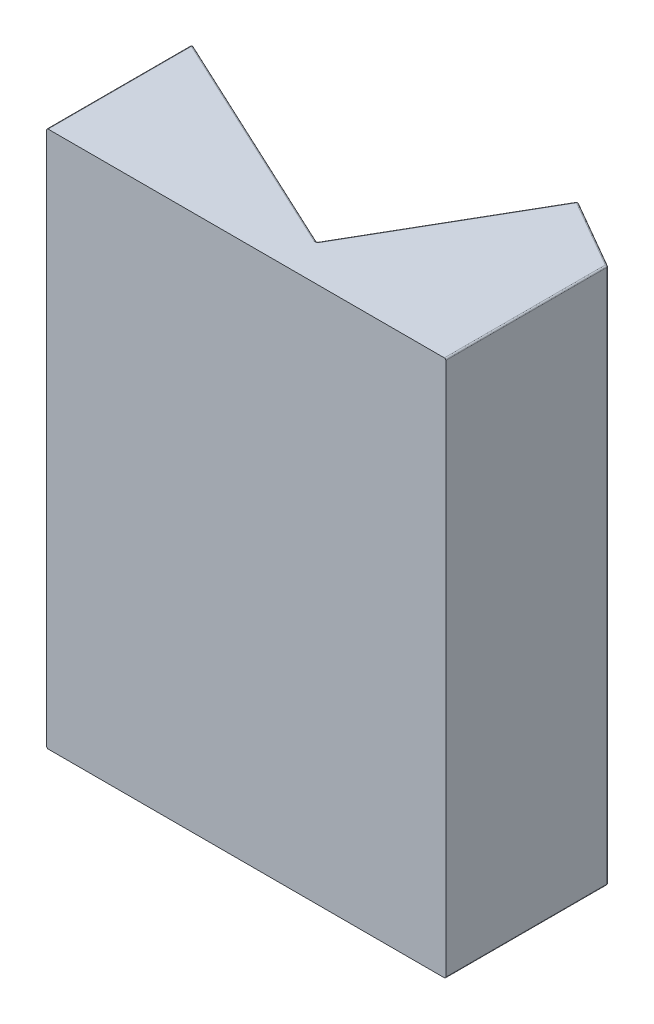
ISO-10303-21;
HEADER;
FILE_DESCRIPTION(('STEP AP214'),'2;1');
FILE_NAME('part.step','',(''),(''),'','','');
FILE_SCHEMA(('AUTOMOTIVE_DESIGN { 1 0 10303 214 1 1 1 1 }'));
ENDSEC;
DATA;
#1=APPLICATION_CONTEXT('core data for automotive mechanical design processes');
#2=APPLICATION_PROTOCOL_DEFINITION('international standard','automotive_design',2000,#1);
#3=PRODUCT_CONTEXT('',#1,'mechanical');
#4=PRODUCT('Part','Part','',(#3));
#5=PRODUCT_RELATED_PRODUCT_CATEGORY('part','',(#4));
#6=PRODUCT_DEFINITION_FORMATION('','',#4);
#7=PRODUCT_DEFINITION_CONTEXT('part definition',#1,'design');
#8=PRODUCT_DEFINITION('design','',#6,#7);
#9=PRODUCT_DEFINITION_SHAPE('','',#8);
#10=(LENGTH_UNIT() NAMED_UNIT(*) SI_UNIT(.MILLI.,.METRE.));
#11=(NAMED_UNIT(*) PLANE_ANGLE_UNIT() SI_UNIT($,.RADIAN.));
#12=(NAMED_UNIT(*) SI_UNIT($,.STERADIAN.) SOLID_ANGLE_UNIT());
#13=UNCERTAINTY_MEASURE_WITH_UNIT(LENGTH_MEASURE(1.E-05),#10,'distance_accuracy_value','');
#14=(GEOMETRIC_REPRESENTATION_CONTEXT(3) GLOBAL_UNCERTAINTY_ASSIGNED_CONTEXT((#13)) GLOBAL_UNIT_ASSIGNED_CONTEXT((#10,
#11,#12)) REPRESENTATION_CONTEXT('',''));
#15=CARTESIAN_POINT('',(0.,0.,0.));
#16=DIRECTION('',(0.,0.,1.));
#17=DIRECTION('',(1.,0.,0.));
#18=AXIS2_PLACEMENT_3D('',#15,#16,#17);
#19=CARTESIAN_POINT('',(31.720772546283,73.,-5.));
#20=DIRECTION('',(-0.422618261740682,0.,0.906307787036658));
#21=DIRECTION('',(0.906307787036658,0.,0.422618261740682));
#22=AXIS2_PLACEMENT_3D('',#19,#20,#21);
#23=PLANE('',#22);
#24=DIRECTION('',(-0.906307787036658,0.,-0.422618261740682));
#25=VECTOR('',#24,1.);
#26=CARTESIAN_POINT('',(0.,0.200000000000006,-19.7916391609239));
#27=LINE('',#26,#25);
#28=CARTESIAN_POINT('',(31.5546769305797,0.200000000000006,-5.07745165758841));
#29=VERTEX_POINT('',#28);
#30=CARTESIAN_POINT('',(0.284523652348131,0.200000000000006,-19.6589636029077));
#31=VERTEX_POINT('',#30);
#32=EDGE_CURVE('E162',#29,#31,#27,.T.);
#33=ORIENTED_EDGE('',*,*,#32,.T.);
#34=DIRECTION('',(0.,-1.,0.));
#35=VECTOR('',#34,1.);
#36=CARTESIAN_POINT('',(0.284523652348129,73.,-19.6589636029077));
#37=LINE('',#36,#35);
#38=CARTESIAN_POINT('',(0.284523652348131,72.8,-19.6589636029077));
#39=VERTEX_POINT('',#38);
#40=EDGE_CURVE('E158',#31,#39,#37,.F.);
#41=ORIENTED_EDGE('',*,*,#40,.T.);
#42=DIRECTION('',(-0.906307787036658,0.,-0.422618261740682));
#43=VECTOR('',#42,1.);
#44=CARTESIAN_POINT('',(31.720772546283,72.8,-5.));
#45=LINE('',#44,#43);
#46=CARTESIAN_POINT('',(31.5546769305797,72.8,-5.07745165758841));
#47=VERTEX_POINT('',#46);
#48=EDGE_CURVE('E151',#39,#47,#45,.F.);
#49=ORIENTED_EDGE('',*,*,#48,.T.);
#50=DIRECTION('',(0.,-1.,0.));
#51=VECTOR('',#50,1.);
#52=CARTESIAN_POINT('',(31.5546769305797,73.,-5.07745165758841));
#53=LINE('',#52,#51);
#54=EDGE_CURVE('E155',#47,#29,#53,.T.);
#55=ORIENTED_EDGE('',*,*,#54,.T.);
#56=EDGE_LOOP('',(#33,#41,#49,#55));
#57=FACE_BOUND('',#56,.T.);
#58=ADVANCED_FACE('F33',(#57),#23,.F.);
#59=CARTESIAN_POINT('',(0.,73.,-19.7916391609239));
#60=DIRECTION('',(1.,0.,0.));
#61=DIRECTION('',(0.,0.,-1.));
#62=AXIS2_PLACEMENT_3D('',#59,#60,#61);
#63=PLANE('',#62);
#64=DIRECTION('',(0.,-1.,0.));
#65=VECTOR('',#64,1.);
#66=CARTESIAN_POINT('',(0.,73.,0.));
#67=LINE('',#66,#65);
#68=CARTESIAN_POINT('',(0.,72.8,0.));
#69=VERTEX_POINT('',#68);
#70=CARTESIAN_POINT('',(0.,0.200000000000006,0.));
#71=VERTEX_POINT('',#70);
#72=EDGE_CURVE('E188',#69,#71,#67,.T.);
#73=ORIENTED_EDGE('',*,*,#72,.F.);
#74=DIRECTION('',(0.,0.,1.));
#75=VECTOR('',#74,1.);
#76=CARTESIAN_POINT('',(0.,72.8,-19.7916391609239));
#77=LINE('',#76,#75);
#78=CARTESIAN_POINT('',(0.,72.8,-19.4777020455004));
#79=VERTEX_POINT('',#78);
#80=EDGE_CURVE('E235',#69,#79,#77,.F.);
#81=ORIENTED_EDGE('',*,*,#80,.T.);
#82=DIRECTION('',(0.,-1.,0.));
#83=VECTOR('',#82,1.);
#84=CARTESIAN_POINT('',(0.,73.,-19.4777020455004));
#85=LINE('',#84,#83);
#86=CARTESIAN_POINT('',(0.,0.200000000000006,-19.4777020455004));
#87=VERTEX_POINT('',#86);
#88=EDGE_CURVE('E233',#79,#87,#85,.T.);
#89=ORIENTED_EDGE('',*,*,#88,.T.);
#90=DIRECTION('',(0.,0.,1.));
#91=VECTOR('',#90,1.);
#92=CARTESIAN_POINT('',(0.,0.200000000000006,0.));
#93=LINE('',#92,#91);
#94=EDGE_CURVE('E231',#87,#71,#93,.T.);
#95=ORIENTED_EDGE('',*,*,#94,.T.);
#96=EDGE_LOOP('',(#73,#81,#89,#95));
#97=FACE_BOUND('',#96,.T.);
#98=ADVANCED_FACE('F358',(#97),#63,.F.);
#99=CARTESIAN_POINT('',(0.,73.,0.));
#100=DIRECTION('',(0.,0.,-1.));
#101=DIRECTION('',(-1.,0.,0.));
#102=AXIS2_PLACEMENT_3D('',#99,#100,#101);
#103=PLANE('',#102);
#104=DIRECTION('',(1.,0.,0.));
#105=VECTOR('',#104,1.);
#106=CARTESIAN_POINT('',(0.,73.,0.));
#107=LINE('',#106,#105);
#108=CARTESIAN_POINT('',(0.2,73.,0.));
#109=VERTEX_POINT('',#108);
#110=CARTESIAN_POINT('',(54.0759088176121,73.,0.));
#111=VERTEX_POINT('',#110);
#112=EDGE_CURVE('E313',#109,#111,#107,.T.);
#113=ORIENTED_EDGE('',*,*,#112,.F.);
#114=CARTESIAN_POINT('',(0.2,72.8,0.));
#115=DIRECTION('',(0.,0.,-1.));
#116=DIRECTION('',(-1.,0.,0.));
#117=AXIS2_PLACEMENT_3D('',#114,#115,#116);
#118=CIRCLE('',#117,0.2);
#119=EDGE_CURVE('E243',#109,#69,#118,.F.);
#120=ORIENTED_EDGE('',*,*,#119,.T.);
#121=ORIENTED_EDGE('',*,*,#72,.T.);
#122=CARTESIAN_POINT('',(0.2,0.200000000000006,0.));
#123=DIRECTION('',(0.,0.,-1.));
#124=DIRECTION('',(-1.,0.,0.));
#125=AXIS2_PLACEMENT_3D('',#122,#123,#124);
#126=CIRCLE('',#125,0.2);
#127=CARTESIAN_POINT('',(0.2,0.,0.));
#128=VERTEX_POINT('',#127);
#129=EDGE_CURVE('E241',#71,#128,#126,.F.);
#130=ORIENTED_EDGE('',*,*,#129,.T.);
#131=DIRECTION('',(1.,0.,0.));
#132=VECTOR('',#131,1.);
#133=CARTESIAN_POINT('',(0.,0.,0.));
#134=LINE('',#133,#132);
#135=CARTESIAN_POINT('',(54.0759088176121,0.,0.));
#136=VERTEX_POINT('',#135);
#137=EDGE_CURVE('E308',#128,#136,#134,.T.);
#138=ORIENTED_EDGE('',*,*,#137,.T.);
#139=CARTESIAN_POINT('',(54.0759088176121,0.2,0.));
#140=DIRECTION('',(0.,0.,-1.));
#141=DIRECTION('',(-1.,0.,0.));
#142=AXIS2_PLACEMENT_3D('',#139,#140,#141);
#143=CIRCLE('',#142,0.2);
#144=CARTESIAN_POINT('',(54.2759088176121,0.200000000000006,0.));
#145=VERTEX_POINT('',#144);
#146=EDGE_CURVE('E239',#136,#145,#143,.F.);
#147=ORIENTED_EDGE('',*,*,#146,.T.);
#148=DIRECTION('',(0.,-1.,0.));
#149=VECTOR('',#148,1.);
#150=CARTESIAN_POINT('',(54.2759088176121,73.,0.));
#151=LINE('',#150,#149);
#152=CARTESIAN_POINT('',(54.2759088176121,72.8,0.));
#153=VERTEX_POINT('',#152);
#154=EDGE_CURVE('E191',#153,#145,#151,.T.);
#155=ORIENTED_EDGE('',*,*,#154,.F.);
#156=CARTESIAN_POINT('',(54.0759088176121,72.8,0.));
#157=DIRECTION('',(0.,0.,-1.));
#158=DIRECTION('',(-1.,0.,0.));
#159=AXIS2_PLACEMENT_3D('',#156,#157,#158);
#160=CIRCLE('',#159,0.2);
#161=EDGE_CURVE('E237',#153,#111,#160,.F.);
#162=ORIENTED_EDGE('',*,*,#161,.T.);
#163=EDGE_LOOP('',(#113,#120,#121,#130,#138,#147,#155,#162));
#164=FACE_BOUND('',#163,.T.);
#165=ADVANCED_FACE('F339',(#164),#103,.F.);
#166=CARTESIAN_POINT('',(54.2759088176121,73.,-22.));
#167=DIRECTION('',(1.,0.,0.));
#168=DIRECTION('',(0.,0.,-1.));
#169=AXIS2_PLACEMENT_3D('',#166,#167,#168);
#170=PLANE('',#169);
#171=ORIENTED_EDGE('',*,*,#154,.T.);
#172=DIRECTION('',(0.,0.,1.));
#173=VECTOR('',#172,1.);
#174=CARTESIAN_POINT('',(54.2759088176121,0.200000000000006,-22.));
#175=LINE('',#174,#173);
#176=CARTESIAN_POINT('',(54.2759088176121,0.2,-21.8845299461621));
#177=VERTEX_POINT('',#176);
#178=EDGE_CURVE('E249',#145,#177,#175,.F.);
#179=ORIENTED_EDGE('',*,*,#178,.T.);
#180=DIRECTION('',(0.,-1.,0.));
#181=VECTOR('',#180,1.);
#182=CARTESIAN_POINT('',(54.2759088176121,73.,-21.8845299461621));
#183=LINE('',#182,#181);
#184=CARTESIAN_POINT('',(54.2759088176121,72.8,-21.8845299461621));
#185=VERTEX_POINT('',#184);
#186=EDGE_CURVE('E245',#177,#185,#183,.F.);
#187=ORIENTED_EDGE('',*,*,#186,.T.);
#188=DIRECTION('',(0.,0.,1.));
#189=VECTOR('',#188,1.);
#190=CARTESIAN_POINT('',(54.2759088176121,72.8,0.));
#191=LINE('',#190,#189);
#192=EDGE_CURVE('E247',#185,#153,#191,.T.);
#193=ORIENTED_EDGE('',*,*,#192,.T.);
#194=EDGE_LOOP('',(#171,#179,#187,#193));
#195=FACE_BOUND('',#194,.T.);
#196=ADVANCED_FACE('F324',(#195),#170,.T.);
#197=CARTESIAN_POINT('',(44.720772546283,73.,-27.5166604983954));
#198=DIRECTION('',(0.499999999999998,0.,-0.866025403784439));
#199=DIRECTION('',(-0.86602540378444,0.,-0.499999999999999));
#200=AXIS2_PLACEMENT_3D('',#197,#198,#199);
#201=PLANE('',#200);
#202=DIRECTION('',(0.86602540378444,0.,0.499999999999999));
#203=VECTOR('',#202,1.);
#204=CARTESIAN_POINT('',(54.2759088176121,72.8,-22.));
#205=LINE('',#204,#203);
#206=CARTESIAN_POINT('',(44.8939776270398,72.8,-27.4166604983954));
#207=VERTEX_POINT('',#206);
#208=CARTESIAN_POINT('',(54.1759088176121,72.8,-22.057735026919));
#209=VERTEX_POINT('',#208);
#210=EDGE_CURVE('E53',#207,#209,#205,.T.);
#211=ORIENTED_EDGE('',*,*,#210,.T.);
#212=DIRECTION('',(0.,-1.,0.));
#213=VECTOR('',#212,1.);
#214=CARTESIAN_POINT('',(54.1759088176121,73.,-22.057735026919));
#215=LINE('',#214,#213);
#216=CARTESIAN_POINT('',(54.1759088176121,0.2,-22.057735026919));
#217=VERTEX_POINT('',#216);
#218=EDGE_CURVE('E11',#209,#217,#215,.T.);
#219=ORIENTED_EDGE('',*,*,#218,.T.);
#220=DIRECTION('',(0.86602540378444,0.,0.499999999999999));
#221=VECTOR('',#220,1.);
#222=CARTESIAN_POINT('',(44.720772546283,0.200000000000006,-27.5166604983954));
#223=LINE('',#222,#221);
#224=CARTESIAN_POINT('',(44.8939776270398,0.2,-27.4166604983954));
#225=VERTEX_POINT('',#224);
#226=EDGE_CURVE('E42',#217,#225,#223,.F.);
#227=ORIENTED_EDGE('',*,*,#226,.T.);
#228=DIRECTION('',(0.,-1.,0.));
#229=VECTOR('',#228,1.);
#230=CARTESIAN_POINT('',(44.8939776270398,73.,-27.4166604983954));
#231=LINE('',#230,#229);
#232=EDGE_CURVE('E251',#225,#207,#231,.F.);
#233=ORIENTED_EDGE('',*,*,#232,.T.);
#234=EDGE_LOOP('',(#211,#219,#227,#233));
#235=FACE_BOUND('',#234,.T.);
#236=ADVANCED_FACE('F388',(#235),#201,.T.);
#237=CARTESIAN_POINT('',(31.720772546283,73.,-5.));
#238=DIRECTION('',(-0.86602540378444,0.,-0.499999999999998));
#239=DIRECTION('',(-0.499999999999998,0.,0.86602540378444));
#240=AXIS2_PLACEMENT_3D('',#237,#238,#239);
#241=PLANE('',#240);
#242=DIRECTION('',(0.499999999999998,0.,-0.86602540378444));
#243=VECTOR('',#242,1.);
#244=CARTESIAN_POINT('',(31.720772546283,0.200000000000006,-5.));
#245=LINE('',#244,#243);
#246=CARTESIAN_POINT('',(44.620772546283,0.2,-27.3434554176385));
#247=VERTEX_POINT('',#246);
#248=CARTESIAN_POINT('',(31.8124056636848,0.2,-5.15871321499574));
#249=VERTEX_POINT('',#248);
#250=EDGE_CURVE('E215',#247,#249,#245,.F.);
#251=ORIENTED_EDGE('',*,*,#250,.T.);
#252=DIRECTION('',(0.,-1.,0.));
#253=VECTOR('',#252,1.);
#254=CARTESIAN_POINT('',(31.8124056636848,73.,-5.15871321499574));
#255=LINE('',#254,#253);
#256=CARTESIAN_POINT('',(31.8124056636848,72.8,-5.15871321499574));
#257=VERTEX_POINT('',#256);
#258=EDGE_CURVE('E218',#249,#257,#255,.F.);
#259=ORIENTED_EDGE('',*,*,#258,.T.);
#260=DIRECTION('',(0.499999999999998,0.,-0.86602540378444));
#261=VECTOR('',#260,1.);
#262=CARTESIAN_POINT('',(44.720772546283,72.8,-27.5166604983954));
#263=LINE('',#262,#261);
#264=CARTESIAN_POINT('',(44.620772546283,72.8,-27.3434554176385));
#265=VERTEX_POINT('',#264);
#266=EDGE_CURVE('E213',#257,#265,#263,.T.);
#267=ORIENTED_EDGE('',*,*,#266,.T.);
#268=DIRECTION('',(0.,-1.,0.));
#269=VECTOR('',#268,1.);
#270=CARTESIAN_POINT('',(44.620772546283,73.,-27.3434554176386));
#271=LINE('',#270,#269);
#272=EDGE_CURVE('E211',#265,#247,#271,.T.);
#273=ORIENTED_EDGE('',*,*,#272,.T.);
#274=EDGE_LOOP('',(#251,#259,#267,#273));
#275=FACE_BOUND('',#274,.T.);
#276=ADVANCED_FACE('F382',(#275),#241,.T.);
#277=CARTESIAN_POINT('',(0.,73.,0.));
#278=DIRECTION('',(0.,-1.,0.));
#279=DIRECTION('',(0.,0.,-1.));
#280=AXIS2_PLACEMENT_3D('',#277,#278,#279);
#281=PLANE('',#280);
#282=DIRECTION('',(-0.906307787036658,0.,-0.422618261740682));
#283=VECTOR('',#282,1.);
#284=CARTESIAN_POINT('',(7.49611394737246,73.,-16.0754682370693));
#285=LINE('',#284,#283);
#286=CARTESIAN_POINT('',(31.4701532782316,73.,-4.89619010018108));
#287=VERTEX_POINT('',#286);
#288=CARTESIAN_POINT('',(0.199999999999994,73.,-19.4777020455004));
#289=VERTEX_POINT('',#288);
#290=EDGE_CURVE('E169',#287,#289,#285,.T.);
#291=ORIENTED_EDGE('',*,*,#290,.T.);
#292=DIRECTION('',(0.,0.,1.));
#293=VECTOR('',#292,1.);
#294=CARTESIAN_POINT('',(0.2,73.,0.));
#295=LINE('',#294,#293);
#296=EDGE_CURVE('E229',#289,#109,#295,.T.);
#297=ORIENTED_EDGE('',*,*,#296,.T.);
#298=ORIENTED_EDGE('',*,*,#112,.T.);
#299=DIRECTION('',(0.,0.,1.));
#300=VECTOR('',#299,1.);
#301=CARTESIAN_POINT('',(54.0759088176121,73.,-22.));
#302=LINE('',#301,#300);
#303=CARTESIAN_POINT('',(54.0759088176121,73.,-21.8845299461621));
#304=VERTEX_POINT('',#303);
#305=EDGE_CURVE('E220',#111,#304,#302,.F.);
#306=ORIENTED_EDGE('',*,*,#305,.T.);
#307=DIRECTION('',(0.86602540378444,0.,0.499999999999999));
#308=VECTOR('',#307,1.);
#309=CARTESIAN_POINT('',(44.620772546283,73.,-27.3434554176385));
#310=LINE('',#309,#308);
#311=CARTESIAN_POINT('',(44.7939776270398,73.,-27.2434554176385));
#312=VERTEX_POINT('',#311);
#313=EDGE_CURVE('E222',#304,#312,#310,.F.);
#314=ORIENTED_EDGE('',*,*,#313,.T.);
#315=DIRECTION('',(0.499999999999998,0.,-0.86602540378444));
#316=VECTOR('',#315,1.);
#317=CARTESIAN_POINT('',(31.8939776270399,73.,-4.9));
#318=LINE('',#317,#316);
#319=CARTESIAN_POINT('',(31.9856107444416,73.,-5.05871321499574));
#320=VERTEX_POINT('',#319);
#321=EDGE_CURVE('E224',#312,#320,#318,.F.);
#322=ORIENTED_EDGE('',*,*,#321,.T.);
#323=CARTESIAN_POINT('',(31.6392005829279,73.,-5.25871321499574));
#324=DIRECTION('',(0.,-1.,0.));
#325=DIRECTION('',(0.,0.,-1.));
#326=AXIS2_PLACEMENT_3D('',#323,#324,#325);
#327=CIRCLE('',#326,0.4);
#328=EDGE_CURVE('E226',#287,#320,#327,.F.);
#329=ORIENTED_EDGE('',*,*,#328,.F.);
#330=EDGE_LOOP('',(#291,#297,#298,#306,#314,#322,#329));
#331=FACE_BOUND('',#330,.T.);
#332=ADVANCED_FACE('F342',(#331),#281,.F.);
#333=CARTESIAN_POINT('',(0.,0.,0.));
#334=DIRECTION('',(0.,-1.,0.));
#335=DIRECTION('',(0.,0.,-1.));
#336=AXIS2_PLACEMENT_3D('',#333,#334,#335);
#337=PLANE('',#336);
#338=ORIENTED_EDGE('',*,*,#137,.F.);
#339=DIRECTION('',(0.,0.,1.));
#340=VECTOR('',#339,1.);
#341=CARTESIAN_POINT('',(0.199999999999994,0.,-19.7916391609239));
#342=LINE('',#341,#340);
#343=CARTESIAN_POINT('',(0.199999999999994,0.,-19.4777020455004));
#344=VERTEX_POINT('',#343);
#345=EDGE_CURVE('E209',#128,#344,#342,.F.);
#346=ORIENTED_EDGE('',*,*,#345,.T.);
#347=DIRECTION('',(-0.906307787036658,0.,-0.422618261740682));
#348=VECTOR('',#347,1.);
#349=CARTESIAN_POINT('',(31.6362488939349,0.,-4.81873844259267));
#350=LINE('',#349,#348);
#351=CARTESIAN_POINT('',(31.4701532782316,0.,-4.89619010018108));
#352=VERTEX_POINT('',#351);
#353=EDGE_CURVE('E206',#344,#352,#350,.F.);
#354=ORIENTED_EDGE('',*,*,#353,.T.);
#355=CARTESIAN_POINT('',(31.6392005829279,0.,-5.25871321499574));
#356=DIRECTION('',(0.,-1.,0.));
#357=DIRECTION('',(0.,0.,-1.));
#358=AXIS2_PLACEMENT_3D('',#355,#356,#357);
#359=CIRCLE('',#358,0.4);
#360=CARTESIAN_POINT('',(31.9856107444416,0.,-5.05871321499574));
#361=VERTEX_POINT('',#360);
#362=EDGE_CURVE('E203',#361,#352,#359,.T.);
#363=ORIENTED_EDGE('',*,*,#362,.F.);
#364=DIRECTION('',(0.499999999999998,0.,-0.86602540378444));
#365=VECTOR('',#364,1.);
#366=CARTESIAN_POINT('',(21.7987209810081,0.,12.5854974263745));
#367=LINE('',#366,#365);
#368=CARTESIAN_POINT('',(44.7939776270399,0.,-27.2434554176386));
#369=VERTEX_POINT('',#368);
#370=EDGE_CURVE('E201',#361,#369,#367,.T.);
#371=ORIENTED_EDGE('',*,*,#370,.T.);
#372=DIRECTION('',(0.86602540378444,0.,0.499999999999999));
#373=VECTOR('',#372,1.);
#374=CARTESIAN_POINT('',(22.9952566460318,0.,-39.8289528440131));
#375=LINE('',#374,#373);
#376=CARTESIAN_POINT('',(54.0759088176121,0.,-21.8845299461621));
#377=VERTEX_POINT('',#376);
#378=EDGE_CURVE('E197',#369,#377,#375,.T.);
#379=ORIENTED_EDGE('',*,*,#378,.T.);
#380=DIRECTION('',(0.,0.,1.));
#381=VECTOR('',#380,1.);
#382=CARTESIAN_POINT('',(54.0759088176121,0.,0.));
#383=LINE('',#382,#381);
#384=EDGE_CURVE('E199',#377,#136,#383,.T.);
#385=ORIENTED_EDGE('',*,*,#384,.T.);
#386=EDGE_LOOP('',(#338,#346,#354,#363,#371,#379,#385));
#387=FACE_BOUND('',#386,.T.);
#388=ADVANCED_FACE('F366',(#387),#337,.T.);
#389=CARTESIAN_POINT('',(54.0759088176121,72.8,-22.));
#390=DIRECTION('',(0.,0.,-1.));
#391=DIRECTION('',(-1.,0.,0.));
#392=AXIS2_PLACEMENT_3D('',#389,#390,#391);
#393=CYLINDRICAL_SURFACE('',#392,0.2);
#394=CARTESIAN_POINT('',(54.0759088176121,72.8,-21.8845299461621));
#395=DIRECTION('',(0.,0.,-1.));
#396=DIRECTION('',(-1.,0.,0.));
#397=AXIS2_PLACEMENT_3D('',#394,#395,#396);
#398=CIRCLE('',#397,0.2);
#399=EDGE_CURVE('E37',#304,#185,#398,.T.);
#400=ORIENTED_EDGE('',*,*,#399,.F.);
#401=ORIENTED_EDGE('',*,*,#305,.F.);
#402=ORIENTED_EDGE('',*,*,#161,.F.);
#403=ORIENTED_EDGE('',*,*,#192,.F.);
#404=EDGE_LOOP('',(#400,#401,#402,#403));
#405=FACE_BOUND('',#404,.T.);
#406=ADVANCED_FACE('F35',(#405),#393,.T.);
#407=CARTESIAN_POINT('',(54.0759088176121,72.8,-21.8845299461621));
#408=DIRECTION('',(0.,0.,1.));
#409=DIRECTION('',(1.,0.,0.));
#410=AXIS2_PLACEMENT_3D('',#407,#408,#409);
#411=SPHERICAL_SURFACE('',#410,0.2);
#412=CARTESIAN_POINT('',(54.0759088176121,72.8,-21.8845299461621));
#413=DIRECTION('',(0.866025403784431,0.,0.500000000000013));
#414=DIRECTION('',(0.500000000000013,0.,-0.866025403784431));
#415=AXIS2_PLACEMENT_3D('',#412,#413,#414);
#416=CIRCLE('',#415,0.2);
#417=EDGE_CURVE('E301',#304,#209,#416,.F.);
#418=ORIENTED_EDGE('',*,*,#417,.F.);
#419=ORIENTED_EDGE('',*,*,#399,.T.);
#420=CARTESIAN_POINT('',(54.0759088176121,72.8,-21.8845299461621));
#421=DIRECTION('',(0.,1.,0.));
#422=DIRECTION('',(0.,0.,1.));
#423=AXIS2_PLACEMENT_3D('',#420,#421,#422);
#424=CIRCLE('',#423,0.2);
#425=EDGE_CURVE('E302',#209,#185,#424,.F.);
#426=ORIENTED_EDGE('',*,*,#425,.F.);
#427=EDGE_LOOP('',(#418,#419,#426));
#428=FACE_BOUND('',#427,.T.);
#429=ADVANCED_FACE('F456',(#428),#411,.T.);
#430=CARTESIAN_POINT('',(54.0759088176121,0.2,0.));
#431=DIRECTION('',(0.,0.,1.));
#432=DIRECTION('',(1.,0.,0.));
#433=AXIS2_PLACEMENT_3D('',#430,#431,#432);
#434=CYLINDRICAL_SURFACE('',#433,0.2);
#435=ORIENTED_EDGE('',*,*,#146,.F.);
#436=ORIENTED_EDGE('',*,*,#384,.F.);
#437=CARTESIAN_POINT('',(54.0759088176121,0.2,-21.8845299461621));
#438=DIRECTION('',(0.,0.,-1.));
#439=DIRECTION('',(0.,1.,0.));
#440=AXIS2_PLACEMENT_3D('',#437,#438,#439);
#441=CIRCLE('',#440,0.2);
#442=EDGE_CURVE('E298',#177,#377,#441,.T.);
#443=ORIENTED_EDGE('',*,*,#442,.F.);
#444=ORIENTED_EDGE('',*,*,#178,.F.);
#445=EDGE_LOOP('',(#435,#436,#443,#444));
#446=FACE_BOUND('',#445,.T.);
#447=ADVANCED_FACE('F329',(#446),#434,.T.);
#448=CARTESIAN_POINT('',(54.0759088176121,73.,-21.8845299461621));
#449=DIRECTION('',(0.,-1.,0.));
#450=DIRECTION('',(0.,0.,-1.));
#451=AXIS2_PLACEMENT_3D('',#448,#449,#450);
#452=CYLINDRICAL_SURFACE('',#451,0.2);
#453=ORIENTED_EDGE('',*,*,#425,.T.);
#454=ORIENTED_EDGE('',*,*,#186,.F.);
#455=CARTESIAN_POINT('',(54.0759088176121,0.2,-21.8845299461621));
#456=DIRECTION('',(0.,-1.,0.));
#457=DIRECTION('',(0.,0.,-1.));
#458=AXIS2_PLACEMENT_3D('',#455,#456,#457);
#459=CIRCLE('',#458,0.2);
#460=EDGE_CURVE('E295',#217,#177,#459,.T.);
#461=ORIENTED_EDGE('',*,*,#460,.F.);
#462=ORIENTED_EDGE('',*,*,#218,.F.);
#463=EDGE_LOOP('',(#453,#454,#461,#462));
#464=FACE_BOUND('',#463,.T.);
#465=ADVANCED_FACE('F335',(#464),#452,.T.);
#466=CARTESIAN_POINT('',(44.620772546283,72.8,-27.3434554176385));
#467=DIRECTION('',(-0.86602540378444,0.,-0.499999999999999));
#468=DIRECTION('',(-0.499999999999998,0.,0.866025403784439));
#469=AXIS2_PLACEMENT_3D('',#466,#467,#468);
#470=CYLINDRICAL_SURFACE('',#469,0.2);
#471=ORIENTED_EDGE('',*,*,#417,.T.);
#472=ORIENTED_EDGE('',*,*,#210,.F.);
#473=CARTESIAN_POINT('',(44.7939776270398,72.8,-27.2434554176385));
#474=DIRECTION('',(-0.866025403784427,0.,-0.500000000000021));
#475=DIRECTION('',(-0.500000000000021,0.,0.866025403784427));
#476=AXIS2_PLACEMENT_3D('',#473,#474,#475);
#477=CIRCLE('',#476,0.2);
#478=EDGE_CURVE('E292',#312,#207,#477,.T.);
#479=ORIENTED_EDGE('',*,*,#478,.F.);
#480=ORIENTED_EDGE('',*,*,#313,.F.);
#481=EDGE_LOOP('',(#471,#472,#479,#480));
#482=FACE_BOUND('',#481,.T.);
#483=ADVANCED_FACE('F449',(#482),#470,.T.);
#484=CARTESIAN_POINT('',(54.0759088176121,0.2,-21.8845299461621));
#485=DIRECTION('',(0.,0.,1.));
#486=DIRECTION('',(1.,0.,0.));
#487=AXIS2_PLACEMENT_3D('',#484,#485,#486);
#488=SPHERICAL_SURFACE('',#487,0.2);
#489=ORIENTED_EDGE('',*,*,#460,.T.);
#490=ORIENTED_EDGE('',*,*,#442,.T.);
#491=CARTESIAN_POINT('',(54.0759088176121,0.2,-21.8845299461621));
#492=DIRECTION('',(0.866025403784422,0.,0.500000000000028));
#493=DIRECTION('',(0.500000000000028,0.,-0.866025403784422));
#494=AXIS2_PLACEMENT_3D('',#491,#492,#493);
#495=CIRCLE('',#494,0.2);
#496=EDGE_CURVE('E289',#217,#377,#495,.F.);
#497=ORIENTED_EDGE('',*,*,#496,.F.);
#498=EDGE_LOOP('',(#489,#490,#497));
#499=FACE_BOUND('',#498,.T.);
#500=ADVANCED_FACE('F333',(#499),#488,.T.);
#501=CARTESIAN_POINT('',(44.7939776270398,72.8,-27.2434554176385));
#502=DIRECTION('',(0.,0.,1.));
#503=DIRECTION('',(1.,0.,0.));
#504=AXIS2_PLACEMENT_3D('',#501,#502,#503);
#505=SPHERICAL_SURFACE('',#504,0.2);
#506=CARTESIAN_POINT('',(44.7939776270399,72.8,-27.2434554176385));
#507=DIRECTION('',(0.499999999999993,0.,-0.866025403784443));
#508=DIRECTION('',(-0.866025403784443,0.,-0.499999999999993));
#509=AXIS2_PLACEMENT_3D('',#506,#507,#508);
#510=CIRCLE('',#509,0.2);
#511=EDGE_CURVE('E283',#312,#265,#510,.F.);
#512=ORIENTED_EDGE('',*,*,#511,.F.);
#513=ORIENTED_EDGE('',*,*,#478,.T.);
#514=CARTESIAN_POINT('',(44.7939776270398,72.8,-27.2434554176385));
#515=DIRECTION('',(0.,1.,0.));
#516=DIRECTION('',(0.,0.,1.));
#517=AXIS2_PLACEMENT_3D('',#514,#515,#516);
#518=CIRCLE('',#517,0.2);
#519=EDGE_CURVE('E286',#265,#207,#518,.F.);
#520=ORIENTED_EDGE('',*,*,#519,.F.);
#521=EDGE_LOOP('',(#512,#513,#520));
#522=FACE_BOUND('',#521,.T.);
#523=ADVANCED_FACE('F443',(#522),#505,.T.);
#524=CARTESIAN_POINT('',(22.9952566460318,0.2,-39.8289528440131));
#525=DIRECTION('',(0.86602540378444,0.,0.499999999999999));
#526=DIRECTION('',(0.499999999999998,0.,-0.866025403784439));
#527=AXIS2_PLACEMENT_3D('',#524,#525,#526);
#528=CYLINDRICAL_SURFACE('',#527,0.2);
#529=ORIENTED_EDGE('',*,*,#496,.T.);
#530=ORIENTED_EDGE('',*,*,#378,.F.);
#531=CARTESIAN_POINT('',(44.7939776270398,0.2,-27.2434554176385));
#532=DIRECTION('',(-0.866025403784431,0.,-0.500000000000013));
#533=DIRECTION('',(-0.500000000000013,0.,0.866025403784431));
#534=AXIS2_PLACEMENT_3D('',#531,#532,#533);
#535=CIRCLE('',#534,0.2);
#536=EDGE_CURVE('E280',#225,#369,#535,.T.);
#537=ORIENTED_EDGE('',*,*,#536,.F.);
#538=ORIENTED_EDGE('',*,*,#226,.F.);
#539=EDGE_LOOP('',(#529,#530,#537,#538));
#540=FACE_BOUND('',#539,.T.);
#541=ADVANCED_FACE('F371',(#540),#528,.T.);
#542=CARTESIAN_POINT('',(44.7939776270399,73.,-27.2434554176385));
#543=DIRECTION('',(0.,-1.,0.));
#544=DIRECTION('',(0.,0.,-1.));
#545=AXIS2_PLACEMENT_3D('',#542,#543,#544);
#546=CYLINDRICAL_SURFACE('',#545,0.2);
#547=ORIENTED_EDGE('',*,*,#519,.T.);
#548=ORIENTED_EDGE('',*,*,#232,.F.);
#549=CARTESIAN_POINT('',(44.7939776270399,0.2,-27.2434554176385));
#550=DIRECTION('',(0.,-1.,0.));
#551=DIRECTION('',(0.,0.,-1.));
#552=AXIS2_PLACEMENT_3D('',#549,#550,#551);
#553=CIRCLE('',#552,0.2);
#554=EDGE_CURVE('E278',#247,#225,#553,.T.);
#555=ORIENTED_EDGE('',*,*,#554,.F.);
#556=ORIENTED_EDGE('',*,*,#272,.F.);
#557=EDGE_LOOP('',(#547,#548,#555,#556));
#558=FACE_BOUND('',#557,.T.);
#559=ADVANCED_FACE('F386',(#558),#546,.T.);
#560=CARTESIAN_POINT('',(31.8939776270399,72.8,-4.9));
#561=DIRECTION('',(-0.499999999999998,0.,0.86602540378444));
#562=DIRECTION('',(0.86602540378444,0.,0.499999999999998));
#563=AXIS2_PLACEMENT_3D('',#560,#561,#562);
#564=CYLINDRICAL_SURFACE('',#563,0.2);
#565=ORIENTED_EDGE('',*,*,#511,.T.);
#566=ORIENTED_EDGE('',*,*,#266,.F.);
#567=CARTESIAN_POINT('',(31.9856107444416,72.8,-5.05871321499574));
#568=DIRECTION('',(-0.499999999999993,0.,0.866025403784443));
#569=DIRECTION('',(0.866025403784443,0.,0.499999999999993));
#570=AXIS2_PLACEMENT_3D('',#567,#568,#569);
#571=CIRCLE('',#570,0.2);
#572=EDGE_CURVE('E172',#320,#257,#571,.T.);
#573=ORIENTED_EDGE('',*,*,#572,.F.);
#574=ORIENTED_EDGE('',*,*,#321,.F.);
#575=EDGE_LOOP('',(#565,#566,#573,#574));
#576=FACE_BOUND('',#575,.T.);
#577=ADVANCED_FACE('F435',(#576),#564,.T.);
#578=CARTESIAN_POINT('',(7.49611394737246,72.8,-16.0754682370693));
#579=DIRECTION('',(-0.906307787036658,0.,-0.422618261740682));
#580=DIRECTION('',(-0.422618261740682,0.,0.906307787036658));
#581=AXIS2_PLACEMENT_3D('',#578,#579,#580);
#582=CYLINDRICAL_SURFACE('',#581,0.2);
#583=CARTESIAN_POINT('',(0.199999999999994,72.8,-19.4777020455004));
#584=DIRECTION('',(-0.90630778703666,0.,-0.422618261740679));
#585=DIRECTION('',(-0.422618261740679,0.,0.90630778703666));
#586=AXIS2_PLACEMENT_3D('',#583,#584,#585);
#587=CIRCLE('',#586,0.2);
#588=EDGE_CURVE('E173',#289,#39,#587,.T.);
#589=ORIENTED_EDGE('',*,*,#588,.F.);
#590=ORIENTED_EDGE('',*,*,#290,.F.);
#591=CARTESIAN_POINT('',(31.4701532782316,72.8,-4.89619010018108));
#592=DIRECTION('',(0.906307787036657,0.,0.422618261740684));
#593=DIRECTION('',(0.422618261740684,0.,-0.906307787036657));
#594=AXIS2_PLACEMENT_3D('',#591,#592,#593);
#595=CIRCLE('',#594,0.2);
#596=EDGE_CURVE('E166',#47,#287,#595,.T.);
#597=ORIENTED_EDGE('',*,*,#596,.F.);
#598=ORIENTED_EDGE('',*,*,#48,.F.);
#599=EDGE_LOOP('',(#589,#590,#597,#598));
#600=FACE_BOUND('',#599,.T.);
#601=ADVANCED_FACE('F168',(#600),#582,.T.);
#602=CARTESIAN_POINT('',(0.2,72.8,0.));
#603=DIRECTION('',(0.,0.,1.));
#604=DIRECTION('',(1.,0.,0.));
#605=AXIS2_PLACEMENT_3D('',#602,#603,#604);
#606=CYLINDRICAL_SURFACE('',#605,0.2);
#607=ORIENTED_EDGE('',*,*,#119,.F.);
#608=ORIENTED_EDGE('',*,*,#296,.F.);
#609=CARTESIAN_POINT('',(0.199999999999994,72.8,-19.4777020455004));
#610=DIRECTION('',(0.,0.,-1.));
#611=DIRECTION('',(-1.,0.,0.));
#612=AXIS2_PLACEMENT_3D('',#609,#610,#611);
#613=CIRCLE('',#612,0.2);
#614=EDGE_CURVE('E273',#79,#289,#613,.T.);
#615=ORIENTED_EDGE('',*,*,#614,.F.);
#616=ORIENTED_EDGE('',*,*,#80,.F.);
#617=EDGE_LOOP('',(#607,#608,#615,#616));
#618=FACE_BOUND('',#617,.T.);
#619=ADVANCED_FACE('F346',(#618),#606,.T.);
#620=CARTESIAN_POINT('',(44.7939776270398,0.2,-27.2434554176385));
#621=DIRECTION('',(0.,0.,1.));
#622=DIRECTION('',(1.,0.,0.));
#623=AXIS2_PLACEMENT_3D('',#620,#621,#622);
#624=SPHERICAL_SURFACE('',#623,0.2);
#625=ORIENTED_EDGE('',*,*,#554,.T.);
#626=ORIENTED_EDGE('',*,*,#536,.T.);
#627=CARTESIAN_POINT('',(44.7939776270399,0.2,-27.2434554176386));
#628=DIRECTION('',(0.49999999999998,0.,-0.86602540378445));
#629=DIRECTION('',(-0.86602540378445,0.,-0.49999999999998));
#630=AXIS2_PLACEMENT_3D('',#627,#628,#629);
#631=CIRCLE('',#630,0.2);
#632=EDGE_CURVE('E182',#247,#369,#631,.F.);
#633=ORIENTED_EDGE('',*,*,#632,.F.);
#634=EDGE_LOOP('',(#625,#626,#633));
#635=FACE_BOUND('',#634,.T.);
#636=ADVANCED_FACE('F375',(#635),#624,.T.);
#637=CARTESIAN_POINT('',(31.6392005829279,72.8,-5.25871321499574));
#638=DIRECTION('',(0.,-1.,0.));
#639=DIRECTION('',(0.,0.,-1.));
#640=AXIS2_PLACEMENT_3D('',#637,#638,#639);
#641=TOROIDAL_SURFACE('',#640,0.4,0.2);
#642=ORIENTED_EDGE('',*,*,#328,.T.);
#643=ORIENTED_EDGE('',*,*,#572,.T.);
#644=CARTESIAN_POINT('',(31.6392005829279,72.8,-5.25871321499574));
#645=DIRECTION('',(0.,-1.,0.));
#646=DIRECTION('',(0.,0.,-1.));
#647=AXIS2_PLACEMENT_3D('',#644,#645,#646);
#648=CIRCLE('',#647,0.2);
#649=EDGE_CURVE('E177',#47,#257,#648,.F.);
#650=ORIENTED_EDGE('',*,*,#649,.F.);
#651=ORIENTED_EDGE('',*,*,#596,.T.);
#652=EDGE_LOOP('',(#642,#643,#650,#651));
#653=FACE_BOUND('',#652,.T.);
#654=ADVANCED_FACE('F178',(#653),#641,.T.);
#655=CARTESIAN_POINT('',(0.199999999999994,72.8,-19.4777020455004));
#656=DIRECTION('',(0.,0.,1.));
#657=DIRECTION('',(1.,0.,0.));
#658=AXIS2_PLACEMENT_3D('',#655,#656,#657);
#659=SPHERICAL_SURFACE('',#658,0.2);
#660=ORIENTED_EDGE('',*,*,#614,.T.);
#661=ORIENTED_EDGE('',*,*,#588,.T.);
#662=CARTESIAN_POINT('',(0.199999999999994,72.8,-19.4777020455004));
#663=DIRECTION('',(0.,1.,0.));
#664=DIRECTION('',(0.,0.,1.));
#665=AXIS2_PLACEMENT_3D('',#662,#663,#664);
#666=CIRCLE('',#665,0.2);
#667=EDGE_CURVE('E183',#79,#39,#666,.F.);
#668=ORIENTED_EDGE('',*,*,#667,.F.);
#669=EDGE_LOOP('',(#660,#661,#668));
#670=FACE_BOUND('',#669,.T.);
#671=ADVANCED_FACE('F350',(#670),#659,.T.);
#672=CARTESIAN_POINT('',(21.7987209810081,0.2,12.5854974263745));
#673=DIRECTION('',(0.499999999999998,0.,-0.86602540378444));
#674=DIRECTION('',(-0.86602540378444,0.,-0.499999999999998));
#675=AXIS2_PLACEMENT_3D('',#672,#673,#674);
#676=CYLINDRICAL_SURFACE('',#675,0.2);
#677=ORIENTED_EDGE('',*,*,#632,.T.);
#678=ORIENTED_EDGE('',*,*,#370,.F.);
#679=CARTESIAN_POINT('',(31.9856107444416,0.2,-5.05871321499574));
#680=DIRECTION('',(-0.499999999999993,0.,0.866025403784443));
#681=DIRECTION('',(0.866025403784443,0.,0.499999999999993));
#682=AXIS2_PLACEMENT_3D('',#679,#680,#681);
#683=CIRCLE('',#682,0.2);
#684=EDGE_CURVE('E266',#249,#361,#683,.T.);
#685=ORIENTED_EDGE('',*,*,#684,.F.);
#686=ORIENTED_EDGE('',*,*,#250,.F.);
#687=EDGE_LOOP('',(#677,#678,#685,#686));
#688=FACE_BOUND('',#687,.T.);
#689=ADVANCED_FACE('F379',(#688),#676,.T.);
#690=CARTESIAN_POINT('',(31.6392005829279,73.,-5.25871321499574));
#691=DIRECTION('',(0.,-1.,0.));
#692=DIRECTION('',(0.,0.,-1.));
#693=AXIS2_PLACEMENT_3D('',#690,#691,#692);
#694=CYLINDRICAL_SURFACE('',#693,0.2);
#695=ORIENTED_EDGE('',*,*,#649,.T.);
#696=ORIENTED_EDGE('',*,*,#258,.F.);
#697=CARTESIAN_POINT('',(31.6392005829279,0.200000000000006,-5.25871321499574));
#698=DIRECTION('',(0.,-1.,0.));
#699=DIRECTION('',(0.,0.,-1.));
#700=AXIS2_PLACEMENT_3D('',#697,#698,#699);
#701=CIRCLE('',#700,0.2);
#702=EDGE_CURVE('E186',#29,#249,#701,.F.);
#703=ORIENTED_EDGE('',*,*,#702,.F.);
#704=ORIENTED_EDGE('',*,*,#54,.F.);
#705=EDGE_LOOP('',(#695,#696,#703,#704));
#706=FACE_BOUND('',#705,.T.);
#707=ADVANCED_FACE('F185',(#706),#694,.F.);
#708=CARTESIAN_POINT('',(0.199999999999994,73.,-19.4777020455004));
#709=DIRECTION('',(0.,-1.,0.));
#710=DIRECTION('',(0.,0.,-1.));
#711=AXIS2_PLACEMENT_3D('',#708,#709,#710);
#712=CYLINDRICAL_SURFACE('',#711,0.2);
#713=ORIENTED_EDGE('',*,*,#667,.T.);
#714=ORIENTED_EDGE('',*,*,#40,.F.);
#715=CARTESIAN_POINT('',(0.199999999999994,0.200000000000006,-19.4777020455004));
#716=DIRECTION('',(0.,-1.,0.));
#717=DIRECTION('',(0.,0.,-1.));
#718=AXIS2_PLACEMENT_3D('',#715,#716,#717);
#719=CIRCLE('',#718,0.2);
#720=EDGE_CURVE('E262',#87,#31,#719,.T.);
#721=ORIENTED_EDGE('',*,*,#720,.F.);
#722=ORIENTED_EDGE('',*,*,#88,.F.);
#723=EDGE_LOOP('',(#713,#714,#721,#722));
#724=FACE_BOUND('',#723,.T.);
#725=ADVANCED_FACE('F354',(#724),#712,.T.);
#726=CARTESIAN_POINT('',(0.199999999999994,0.200000000000006,-19.7916391609239));
#727=DIRECTION('',(0.,0.,-1.));
#728=DIRECTION('',(-1.,0.,0.));
#729=AXIS2_PLACEMENT_3D('',#726,#727,#728);
#730=CYLINDRICAL_SURFACE('',#729,0.2);
#731=ORIENTED_EDGE('',*,*,#129,.F.);
#732=ORIENTED_EDGE('',*,*,#94,.F.);
#733=CARTESIAN_POINT('',(0.199999999999994,0.2,-19.4777020455004));
#734=DIRECTION('',(0.,0.,-1.));
#735=DIRECTION('',(-1.,0.,0.));
#736=AXIS2_PLACEMENT_3D('',#733,#734,#735);
#737=CIRCLE('',#736,0.2);
#738=EDGE_CURVE('E259',#344,#87,#737,.T.);
#739=ORIENTED_EDGE('',*,*,#738,.F.);
#740=ORIENTED_EDGE('',*,*,#345,.F.);
#741=EDGE_LOOP('',(#731,#732,#739,#740));
#742=FACE_BOUND('',#741,.T.);
#743=ADVANCED_FACE('F362',(#742),#730,.T.);
#744=CARTESIAN_POINT('',(31.6392005829279,0.200000000000006,-5.25871321499574));
#745=DIRECTION('',(0.,-1.,0.));
#746=DIRECTION('',(0.,0.,-1.));
#747=AXIS2_PLACEMENT_3D('',#744,#745,#746);
#748=TOROIDAL_SURFACE('',#747,0.4,0.2);
#749=ORIENTED_EDGE('',*,*,#684,.T.);
#750=ORIENTED_EDGE('',*,*,#362,.T.);
#751=CARTESIAN_POINT('',(31.4701532782316,0.2,-4.89619010018108));
#752=DIRECTION('',(0.906307787036657,0.,0.422618261740684));
#753=DIRECTION('',(0.422618261740684,0.,-0.906307787036657));
#754=AXIS2_PLACEMENT_3D('',#751,#752,#753);
#755=CIRCLE('',#754,0.2);
#756=EDGE_CURVE('E257',#29,#352,#755,.F.);
#757=ORIENTED_EDGE('',*,*,#756,.F.);
#758=ORIENTED_EDGE('',*,*,#702,.T.);
#759=EDGE_LOOP('',(#749,#750,#757,#758));
#760=FACE_BOUND('',#759,.T.);
#761=ADVANCED_FACE('F412',(#760),#748,.T.);
#762=CARTESIAN_POINT('',(0.199999999999994,0.2,-19.4777020455004));
#763=DIRECTION('',(0.,0.,1.));
#764=DIRECTION('',(1.,0.,0.));
#765=AXIS2_PLACEMENT_3D('',#762,#763,#764);
#766=SPHERICAL_SURFACE('',#765,0.2);
#767=ORIENTED_EDGE('',*,*,#738,.T.);
#768=ORIENTED_EDGE('',*,*,#720,.T.);
#769=CARTESIAN_POINT('',(0.199999999999994,0.200000000000006,-19.4777020455004));
#770=DIRECTION('',(-0.906307787036657,0.,-0.422618261740684));
#771=DIRECTION('',(-0.422618261740684,0.,0.906307787036657));
#772=AXIS2_PLACEMENT_3D('',#769,#770,#771);
#773=CIRCLE('',#772,0.2);
#774=EDGE_CURVE('E255',#344,#31,#773,.F.);
#775=ORIENTED_EDGE('',*,*,#774,.F.);
#776=EDGE_LOOP('',(#767,#768,#775));
#777=FACE_BOUND('',#776,.T.);
#778=ADVANCED_FACE('F408',(#777),#766,.T.);
#779=CARTESIAN_POINT('',(31.6362488939349,0.200000000000006,-4.81873844259267));
#780=DIRECTION('',(0.906307787036658,0.,0.422618261740682));
#781=DIRECTION('',(0.422618261740682,0.,-0.906307787036658));
#782=AXIS2_PLACEMENT_3D('',#779,#780,#781);
#783=CYLINDRICAL_SURFACE('',#782,0.2);
#784=ORIENTED_EDGE('',*,*,#756,.T.);
#785=ORIENTED_EDGE('',*,*,#353,.F.);
#786=ORIENTED_EDGE('',*,*,#774,.T.);
#787=ORIENTED_EDGE('',*,*,#32,.F.);
#788=EDGE_LOOP('',(#784,#785,#786,#787));
#789=FACE_BOUND('',#788,.T.);
#790=ADVANCED_FACE('F405',(#789),#783,.T.);
#791=CLOSED_SHELL('',(#58,#98,#165,#196,#236,#276,#332,#388,#406,#429,#447,#465,#483,#500,#523,
#541,#559,#577,#601,#619,#636,#654,#671,#689,#707,#725,#743,#761,#778,#790));
#792=MANIFOLD_SOLID_BREP('B2',#791);
#793=ADVANCED_BREP_SHAPE_REPRESENTATION('',(#18,#792),#14);
#794=SHAPE_DEFINITION_REPRESENTATION(#9,#793);
ENDSEC;
END-ISO-10303-21;
